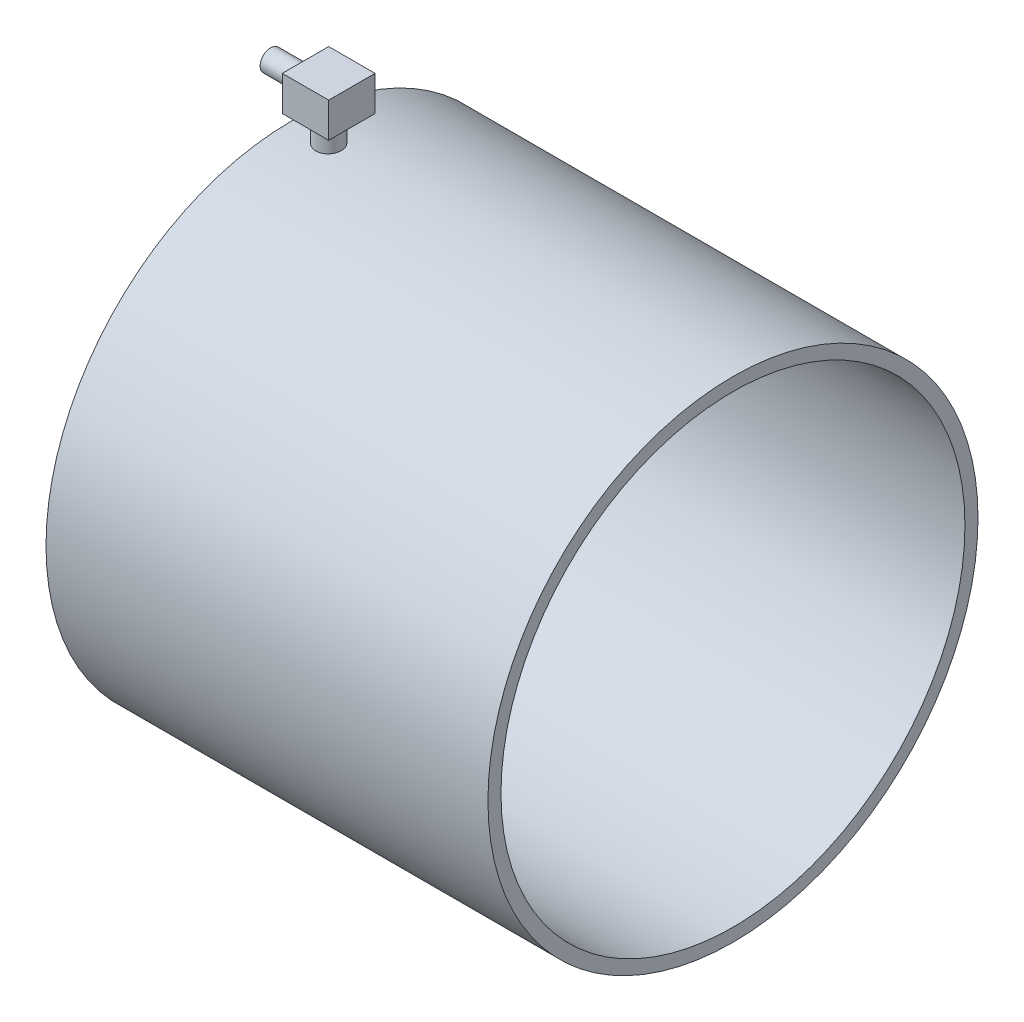
ISO-10303-21;
HEADER;
FILE_DESCRIPTION(('STEP AP214'),'2;1');
FILE_NAME('part.step','',(''),(''),'','','');
FILE_SCHEMA(('AUTOMOTIVE_DESIGN { 1 0 10303 214 1 1 1 1 }'));
ENDSEC;
DATA;
#1=APPLICATION_CONTEXT('core data for automotive mechanical design processes');
#2=APPLICATION_PROTOCOL_DEFINITION('international standard','automotive_design',2000,#1);
#3=PRODUCT_CONTEXT('',#1,'mechanical');
#4=PRODUCT('Part','Part','',(#3));
#5=PRODUCT_RELATED_PRODUCT_CATEGORY('part','',(#4));
#6=PRODUCT_DEFINITION_FORMATION('','',#4);
#7=PRODUCT_DEFINITION_CONTEXT('part definition',#1,'design');
#8=PRODUCT_DEFINITION('design','',#6,#7);
#9=PRODUCT_DEFINITION_SHAPE('','',#8);
#10=(LENGTH_UNIT() NAMED_UNIT(*) SI_UNIT(.MILLI.,.METRE.));
#11=(NAMED_UNIT(*) PLANE_ANGLE_UNIT() SI_UNIT($,.RADIAN.));
#12=(NAMED_UNIT(*) SI_UNIT($,.STERADIAN.) SOLID_ANGLE_UNIT());
#13=UNCERTAINTY_MEASURE_WITH_UNIT(LENGTH_MEASURE(1.E-05),#10,'distance_accuracy_value','');
#14=(GEOMETRIC_REPRESENTATION_CONTEXT(3) GLOBAL_UNCERTAINTY_ASSIGNED_CONTEXT((#13)) GLOBAL_UNIT_ASSIGNED_CONTEXT((#10,
#11,#12)) REPRESENTATION_CONTEXT('',''));
#15=CARTESIAN_POINT('',(0.,0.,0.));
#16=DIRECTION('',(0.,0.,1.));
#17=DIRECTION('',(1.,0.,0.));
#18=AXIS2_PLACEMENT_3D('',#15,#16,#17);
#19=CARTESIAN_POINT('',(3.24493305569254,23.3300961428042,0.));
#20=DIRECTION('',(0.,-1.,0.));
#21=DIRECTION('',(0.,0.,-1.));
#22=AXIS2_PLACEMENT_3D('',#19,#20,#21);
#23=CYLINDRICAL_SURFACE('',#22,1.1044126273876);
#24=CARTESIAN_POINT('',(3.24493305569254,23.3300961428042,0.));
#25=DIRECTION('',(0.,1.,0.));
#26=DIRECTION('',(0.,0.,1.));
#27=AXIS2_PLACEMENT_3D('',#24,#25,#26);
#28=CIRCLE('',#27,1.1044126273876);
#29=CARTESIAN_POINT('',(3.24493305569254,23.3300961428042,1.1044126273876));
#30=VERTEX_POINT('',#29);
#31=EDGE_CURVE('E63',#30,#30,#28,.T.);
#32=ORIENTED_EDGE('',*,*,#31,.F.);
#33=EDGE_LOOP('',(#32));
#34=FACE_BOUND('',#33,.T.);
#35=CARTESIAN_POINT('',(3.24493305569254,20.3300961428042,0.));
#36=DIRECTION('',(0.,1.,0.));
#37=DIRECTION('',(0.,0.,1.));
#38=AXIS2_PLACEMENT_3D('',#35,#36,#37);
#39=CIRCLE('',#38,1.1044126273876);
#40=CARTESIAN_POINT('',(3.24493305569254,20.3300961428042,1.1044126273876));
#41=VERTEX_POINT('',#40);
#42=EDGE_CURVE('E132',#41,#41,#39,.T.);
#43=ORIENTED_EDGE('',*,*,#42,.T.);
#44=EDGE_LOOP('',(#43));
#45=FACE_BOUND('',#44,.T.);
#46=ADVANCED_FACE('F55',(#34,#45),#23,.T.);
#47=CARTESIAN_POINT('',(3.24493305569254,20.3300961428042,0.));
#48=DIRECTION('',(0.,1.,0.));
#49=DIRECTION('',(0.,0.,1.));
#50=AXIS2_PLACEMENT_3D('',#47,#48,#49);
#51=PLANE('',#50);
#52=ORIENTED_EDGE('',*,*,#42,.F.);
#53=EDGE_LOOP('',(#52));
#54=FACE_BOUND('',#53,.T.);
#55=ADVANCED_FACE('F138',(#54),#51,.F.);
#56=CARTESIAN_POINT('',(1.24493305569254,26.3300961428042,-2.));
#57=DIRECTION('',(1.,0.,0.));
#58=DIRECTION('',(0.,0.,-1.));
#59=AXIS2_PLACEMENT_3D('',#56,#57,#58);
#60=PLANE('',#59);
#61=CARTESIAN_POINT('',(1.24493305569254,24.83009614,0.));
#62=DIRECTION('',(1.,0.,0.));
#63=DIRECTION('',(0.,0.,-1.));
#64=AXIS2_PLACEMENT_3D('',#61,#62,#63);
#65=CIRCLE('',#64,0.913347132426428);
#66=CARTESIAN_POINT('',(1.24493305569254,24.83009614,-0.913347132426428));
#67=VERTEX_POINT('',#66);
#68=EDGE_CURVE('E13',#67,#67,#65,.F.);
#69=ORIENTED_EDGE('',*,*,#68,.F.);
#70=EDGE_LOOP('',(#69));
#71=FACE_BOUND('',#70,.T.);
#72=DIRECTION('',(0.,0.,1.));
#73=VECTOR('',#72,1.);
#74=CARTESIAN_POINT('',(1.24493305569254,23.3300961428042,-2.));
#75=LINE('',#74,#73);
#76=CARTESIAN_POINT('',(1.24493305569254,23.3300961428042,-2.));
#77=VERTEX_POINT('',#76);
#78=CARTESIAN_POINT('',(1.24493305569254,23.3300961428042,2.));
#79=VERTEX_POINT('',#78);
#80=EDGE_CURVE('E122',#77,#79,#75,.T.);
#81=ORIENTED_EDGE('',*,*,#80,.T.);
#82=DIRECTION('',(0.,-1.,0.));
#83=VECTOR('',#82,1.);
#84=CARTESIAN_POINT('',(1.24493305569254,26.3300961428042,2.));
#85=LINE('',#84,#83);
#86=CARTESIAN_POINT('',(1.24493305569254,26.3300961428042,2.));
#87=VERTEX_POINT('',#86);
#88=EDGE_CURVE('E113',#87,#79,#85,.T.);
#89=ORIENTED_EDGE('',*,*,#88,.F.);
#90=DIRECTION('',(0.,0.,1.));
#91=VECTOR('',#90,1.);
#92=CARTESIAN_POINT('',(1.24493305569254,26.3300961428042,-2.));
#93=LINE('',#92,#91);
#94=CARTESIAN_POINT('',(1.24493305569254,26.3300961428042,-2.));
#95=VERTEX_POINT('',#94);
#96=EDGE_CURVE('E107',#95,#87,#93,.T.);
#97=ORIENTED_EDGE('',*,*,#96,.F.);
#98=DIRECTION('',(0.,-1.,0.));
#99=VECTOR('',#98,1.);
#100=CARTESIAN_POINT('',(1.24493305569254,26.3300961428042,-2.));
#101=LINE('',#100,#99);
#102=EDGE_CURVE('E118',#95,#77,#101,.T.);
#103=ORIENTED_EDGE('',*,*,#102,.T.);
#104=EDGE_LOOP('',(#81,#89,#97,#103));
#105=FACE_BOUND('',#104,.T.);
#106=ADVANCED_FACE('F140',(#71,#105),#60,.F.);
#107=CARTESIAN_POINT('',(5.24493305569254,26.3300961428042,2.));
#108=DIRECTION('',(0.,0.,-1.));
#109=DIRECTION('',(-1.,0.,0.));
#110=AXIS2_PLACEMENT_3D('',#107,#108,#109);
#111=PLANE('',#110);
#112=DIRECTION('',(1.,0.,0.));
#113=VECTOR('',#112,1.);
#114=CARTESIAN_POINT('',(5.24493305569254,23.3300961428042,2.));
#115=LINE('',#114,#113);
#116=CARTESIAN_POINT('',(5.24493305569254,23.3300961428042,2.));
#117=VERTEX_POINT('',#116);
#118=EDGE_CURVE('E112',#79,#117,#115,.T.);
#119=ORIENTED_EDGE('',*,*,#118,.T.);
#120=DIRECTION('',(0.,-1.,0.));
#121=VECTOR('',#120,1.);
#122=CARTESIAN_POINT('',(5.24493305569254,26.3300961428042,2.));
#123=LINE('',#122,#121);
#124=CARTESIAN_POINT('',(5.24493305569254,26.3300961428042,2.));
#125=VERTEX_POINT('',#124);
#126=EDGE_CURVE('E110',#125,#117,#123,.T.);
#127=ORIENTED_EDGE('',*,*,#126,.F.);
#128=DIRECTION('',(1.,0.,0.));
#129=VECTOR('',#128,1.);
#130=CARTESIAN_POINT('',(5.24493305569254,26.3300961428042,2.));
#131=LINE('',#130,#129);
#132=EDGE_CURVE('E102',#87,#125,#131,.T.);
#133=ORIENTED_EDGE('',*,*,#132,.F.);
#134=ORIENTED_EDGE('',*,*,#88,.T.);
#135=EDGE_LOOP('',(#119,#127,#133,#134));
#136=FACE_BOUND('',#135,.T.);
#137=ADVANCED_FACE('F111',(#136),#111,.F.);
#138=CARTESIAN_POINT('',(5.24493305569254,26.3300961428042,-2.));
#139=DIRECTION('',(-1.,0.,0.));
#140=DIRECTION('',(0.,0.,1.));
#141=AXIS2_PLACEMENT_3D('',#138,#139,#140);
#142=PLANE('',#141);
#143=DIRECTION('',(0.,0.,-1.));
#144=VECTOR('',#143,1.);
#145=CARTESIAN_POINT('',(5.24493305569254,23.3300961428042,-2.));
#146=LINE('',#145,#144);
#147=CARTESIAN_POINT('',(5.24493305569254,23.3300961428042,-2.));
#148=VERTEX_POINT('',#147);
#149=EDGE_CURVE('E88',#117,#148,#146,.T.);
#150=ORIENTED_EDGE('',*,*,#149,.T.);
#151=DIRECTION('',(0.,-1.,0.));
#152=VECTOR('',#151,1.);
#153=CARTESIAN_POINT('',(5.24493305569254,26.3300961428042,-2.));
#154=LINE('',#153,#152);
#155=CARTESIAN_POINT('',(5.24493305569254,26.3300961428042,-2.));
#156=VERTEX_POINT('',#155);
#157=EDGE_CURVE('E114',#156,#148,#154,.T.);
#158=ORIENTED_EDGE('',*,*,#157,.F.);
#159=DIRECTION('',(0.,0.,-1.));
#160=VECTOR('',#159,1.);
#161=CARTESIAN_POINT('',(5.24493305569254,26.3300961428042,-2.));
#162=LINE('',#161,#160);
#163=EDGE_CURVE('E105',#125,#156,#162,.T.);
#164=ORIENTED_EDGE('',*,*,#163,.F.);
#165=ORIENTED_EDGE('',*,*,#126,.T.);
#166=EDGE_LOOP('',(#150,#158,#164,#165));
#167=FACE_BOUND('',#166,.T.);
#168=ADVANCED_FACE('F116',(#167),#142,.F.);
#169=CARTESIAN_POINT('',(5.24493305569254,26.3300961428042,-2.));
#170=DIRECTION('',(0.,0.,1.));
#171=DIRECTION('',(1.,0.,0.));
#172=AXIS2_PLACEMENT_3D('',#169,#170,#171);
#173=PLANE('',#172);
#174=DIRECTION('',(-1.,0.,0.));
#175=VECTOR('',#174,1.);
#176=CARTESIAN_POINT('',(5.24493305569254,23.3300961428042,-2.));
#177=LINE('',#176,#175);
#178=EDGE_CURVE('E94',#148,#77,#177,.T.);
#179=ORIENTED_EDGE('',*,*,#178,.T.);
#180=ORIENTED_EDGE('',*,*,#102,.F.);
#181=DIRECTION('',(-1.,0.,0.));
#182=VECTOR('',#181,1.);
#183=CARTESIAN_POINT('',(5.24493305569254,26.3300961428042,-2.));
#184=LINE('',#183,#182);
#185=EDGE_CURVE('E71',#156,#95,#184,.T.);
#186=ORIENTED_EDGE('',*,*,#185,.F.);
#187=ORIENTED_EDGE('',*,*,#157,.T.);
#188=EDGE_LOOP('',(#179,#180,#186,#187));
#189=FACE_BOUND('',#188,.T.);
#190=ADVANCED_FACE('F154',(#189),#173,.F.);
#191=CARTESIAN_POINT('',(0.,26.3300961428042,0.));
#192=DIRECTION('',(0.,-1.,0.));
#193=DIRECTION('',(0.,0.,-1.));
#194=AXIS2_PLACEMENT_3D('',#191,#192,#193);
#195=PLANE('',#194);
#196=ORIENTED_EDGE('',*,*,#96,.T.);
#197=ORIENTED_EDGE('',*,*,#132,.T.);
#198=ORIENTED_EDGE('',*,*,#163,.T.);
#199=ORIENTED_EDGE('',*,*,#185,.T.);
#200=EDGE_LOOP('',(#196,#197,#198,#199));
#201=FACE_BOUND('',#200,.T.);
#202=ADVANCED_FACE('F103',(#201),#195,.F.);
#203=CARTESIAN_POINT('',(0.,23.3300961428042,0.));
#204=DIRECTION('',(0.,-1.,0.));
#205=DIRECTION('',(0.,0.,-1.));
#206=AXIS2_PLACEMENT_3D('',#203,#204,#205);
#207=PLANE('',#206);
#208=ORIENTED_EDGE('',*,*,#31,.T.);
#209=EDGE_LOOP('',(#208));
#210=FACE_BOUND('',#209,.T.);
#211=ORIENTED_EDGE('',*,*,#80,.F.);
#212=ORIENTED_EDGE('',*,*,#178,.F.);
#213=ORIENTED_EDGE('',*,*,#149,.F.);
#214=ORIENTED_EDGE('',*,*,#118,.F.);
#215=EDGE_LOOP('',(#211,#212,#213,#214));
#216=FACE_BOUND('',#215,.T.);
#217=ADVANCED_FACE('F157',(#210,#216),#207,.T.);
#218=CARTESIAN_POINT('',(-1.75506694430746,24.83009614,0.));
#219=DIRECTION('',(-1.,0.,0.));
#220=DIRECTION('',(0.,0.,1.));
#221=AXIS2_PLACEMENT_3D('',#218,#219,#220);
#222=PLANE('',#221);
#223=CARTESIAN_POINT('',(-1.75506694430746,24.83009614,0.));
#224=DIRECTION('',(-1.,0.,0.));
#225=DIRECTION('',(0.,0.,1.));
#226=AXIS2_PLACEMENT_3D('',#223,#224,#225);
#227=CIRCLE('',#226,0.913347132426428);
#228=CARTESIAN_POINT('',(-1.75506694430746,24.83009614,0.913347132426428));
#229=VERTEX_POINT('',#228);
#230=EDGE_CURVE('E125',#229,#229,#227,.T.);
#231=ORIENTED_EDGE('',*,*,#230,.T.);
#232=EDGE_LOOP('',(#231));
#233=FACE_BOUND('',#232,.T.);
#234=CARTESIAN_POINT('',(-1.75506694430746,24.83009614,0.));
#235=DIRECTION('',(-1.,0.,0.));
#236=DIRECTION('',(0.,0.,1.));
#237=AXIS2_PLACEMENT_3D('',#234,#235,#236);
#238=CIRCLE('',#237,0.661870058374341);
#239=CARTESIAN_POINT('',(-1.75506694430746,24.83009614,0.661870058374342));
#240=VERTEX_POINT('',#239);
#241=EDGE_CURVE('E181',#240,#240,#238,.T.);
#242=ORIENTED_EDGE('',*,*,#241,.F.);
#243=EDGE_LOOP('',(#242));
#244=FACE_BOUND('',#243,.T.);
#245=ADVANCED_FACE('F160',(#233,#244),#222,.T.);
#246=CARTESIAN_POINT('',(-1.75506694430746,24.83009614,0.));
#247=DIRECTION('',(1.,0.,0.));
#248=DIRECTION('',(0.,0.,-1.));
#249=AXIS2_PLACEMENT_3D('',#246,#247,#248);
#250=CYLINDRICAL_SURFACE('',#249,0.913347132426428);
#251=ORIENTED_EDGE('',*,*,#230,.F.);
#252=EDGE_LOOP('',(#251));
#253=FACE_BOUND('',#252,.T.);
#254=ORIENTED_EDGE('',*,*,#68,.T.);
#255=EDGE_LOOP('',(#254));
#256=FACE_BOUND('',#255,.T.);
#257=ADVANCED_FACE('F164',(#253,#256),#250,.T.);
#258=CARTESIAN_POINT('',(-1.75506694430746,24.83009614,0.));
#259=DIRECTION('',(1.,0.,0.));
#260=DIRECTION('',(0.,0.,-1.));
#261=AXIS2_PLACEMENT_3D('',#258,#259,#260);
#262=CYLINDRICAL_SURFACE('',#261,0.661870058374341);
#263=ORIENTED_EDGE('',*,*,#241,.T.);
#264=EDGE_LOOP('',(#263));
#265=FACE_BOUND('',#264,.T.);
#266=CARTESIAN_POINT('',(1.24493305569254,24.83009614,0.));
#267=DIRECTION('',(-1.,0.,0.));
#268=DIRECTION('',(0.,0.,1.));
#269=AXIS2_PLACEMENT_3D('',#266,#267,#268);
#270=CIRCLE('',#269,0.661870058374341);
#271=CARTESIAN_POINT('',(1.24493305569254,24.83009614,0.661870058374341));
#272=VERTEX_POINT('',#271);
#273=EDGE_CURVE('E184',#272,#272,#270,.T.);
#274=ORIENTED_EDGE('',*,*,#273,.F.);
#275=EDGE_LOOP('',(#274));
#276=FACE_BOUND('',#275,.T.);
#277=ADVANCED_FACE('F167',(#265,#276),#262,.F.);
#278=ORIENTED_EDGE('',*,*,#273,.T.);
#279=EDGE_LOOP('',(#278));
#280=FACE_BOUND('',#279,.T.);
#281=ADVANCED_FACE('F147',(#280),#60,.F.);
#282=CLOSED_SHELL('',(#46,#55,#106,#137,#168,#190,#202,#217,#245,#257,#277,#281));
#283=MANIFOLD_SOLID_BREP('B2',#282);
#284=CARTESIAN_POINT('',(38.1,0.,0.));
#285=DIRECTION('',(1.,0.,0.));
#286=DIRECTION('',(0.,0.,-1.));
#287=AXIS2_PLACEMENT_3D('',#284,#285,#286);
#288=PLANE('',#287);
#289=CARTESIAN_POINT('',(38.1,0.,0.));
#290=DIRECTION('',(1.,0.,0.));
#291=DIRECTION('',(0.,0.,-1.));
#292=AXIS2_PLACEMENT_3D('',#289,#290,#291);
#293=CIRCLE('',#292,21.125);
#294=CARTESIAN_POINT('',(38.1,0.,-21.125));
#295=VERTEX_POINT('',#294);
#296=EDGE_CURVE('E54',#295,#295,#293,.T.);
#297=ORIENTED_EDGE('',*,*,#296,.T.);
#298=EDGE_LOOP('',(#297));
#299=FACE_BOUND('',#298,.T.);
#300=CARTESIAN_POINT('',(38.1,0.,0.));
#301=DIRECTION('',(1.,0.,0.));
#302=DIRECTION('',(0.,0.,-1.));
#303=AXIS2_PLACEMENT_3D('',#300,#301,#302);
#304=CIRCLE('',#303,20.);
#305=CARTESIAN_POINT('',(38.1,0.,-20.));
#306=VERTEX_POINT('',#305);
#307=EDGE_CURVE('E281',#306,#306,#304,.T.);
#308=ORIENTED_EDGE('',*,*,#307,.F.);
#309=EDGE_LOOP('',(#308));
#310=FACE_BOUND('',#309,.T.);
#311=ADVANCED_FACE('F268',(#299,#310),#288,.T.);
#312=CARTESIAN_POINT('',(0.,0.,0.));
#313=DIRECTION('',(1.,0.,0.));
#314=DIRECTION('',(0.,0.,-1.));
#315=AXIS2_PLACEMENT_3D('',#312,#313,#314);
#316=PLANE('',#315);
#317=CARTESIAN_POINT('',(0.,0.,0.));
#318=DIRECTION('',(1.,0.,0.));
#319=DIRECTION('',(0.,0.,-1.));
#320=AXIS2_PLACEMENT_3D('',#317,#318,#319);
#321=CIRCLE('',#320,21.125);
#322=CARTESIAN_POINT('',(0.,0.,-21.125));
#323=VERTEX_POINT('',#322);
#324=EDGE_CURVE('E272',#323,#323,#321,.T.);
#325=ORIENTED_EDGE('',*,*,#324,.F.);
#326=EDGE_LOOP('',(#325));
#327=FACE_BOUND('',#326,.T.);
#328=CARTESIAN_POINT('',(0.,0.,0.));
#329=DIRECTION('',(1.,0.,0.));
#330=DIRECTION('',(0.,0.,-1.));
#331=AXIS2_PLACEMENT_3D('',#328,#329,#330);
#332=CIRCLE('',#331,20.);
#333=CARTESIAN_POINT('',(0.,0.,-20.));
#334=VERTEX_POINT('',#333);
#335=EDGE_CURVE('E283',#334,#334,#332,.T.);
#336=ORIENTED_EDGE('',*,*,#335,.T.);
#337=EDGE_LOOP('',(#336));
#338=FACE_BOUND('',#337,.T.);
#339=ADVANCED_FACE('F295',(#327,#338),#316,.F.);
#340=CARTESIAN_POINT('',(38.1,0.,0.));
#341=DIRECTION('',(-1.,0.,0.));
#342=DIRECTION('',(0.,0.,1.));
#343=AXIS2_PLACEMENT_3D('',#340,#341,#342);
#344=CYLINDRICAL_SURFACE('',#343,21.125);
#345=ORIENTED_EDGE('',*,*,#296,.F.);
#346=EDGE_LOOP('',(#345));
#347=FACE_BOUND('',#346,.T.);
#348=ORIENTED_EDGE('',*,*,#324,.T.);
#349=EDGE_LOOP('',(#348));
#350=FACE_BOUND('',#349,.T.);
#351=ADVANCED_FACE('F270',(#347,#350),#344,.T.);
#352=CARTESIAN_POINT('',(38.1,0.,0.));
#353=DIRECTION('',(-1.,0.,0.));
#354=DIRECTION('',(0.,0.,1.));
#355=AXIS2_PLACEMENT_3D('',#352,#353,#354);
#356=CYLINDRICAL_SURFACE('',#355,20.);
#357=ORIENTED_EDGE('',*,*,#307,.T.);
#358=EDGE_LOOP('',(#357));
#359=FACE_BOUND('',#358,.T.);
#360=ORIENTED_EDGE('',*,*,#335,.F.);
#361=EDGE_LOOP('',(#360));
#362=FACE_BOUND('',#361,.T.);
#363=ADVANCED_FACE('F291',(#359,#362),#356,.F.);
#364=CLOSED_SHELL('',(#311,#339,#351,#363));
#365=MANIFOLD_SOLID_BREP('B7',#364);
#366=ADVANCED_BREP_SHAPE_REPRESENTATION('',(#18,#283,#365),#14);
#367=SHAPE_DEFINITION_REPRESENTATION(#9,#366);
ENDSEC;
END-ISO-10303-21;
